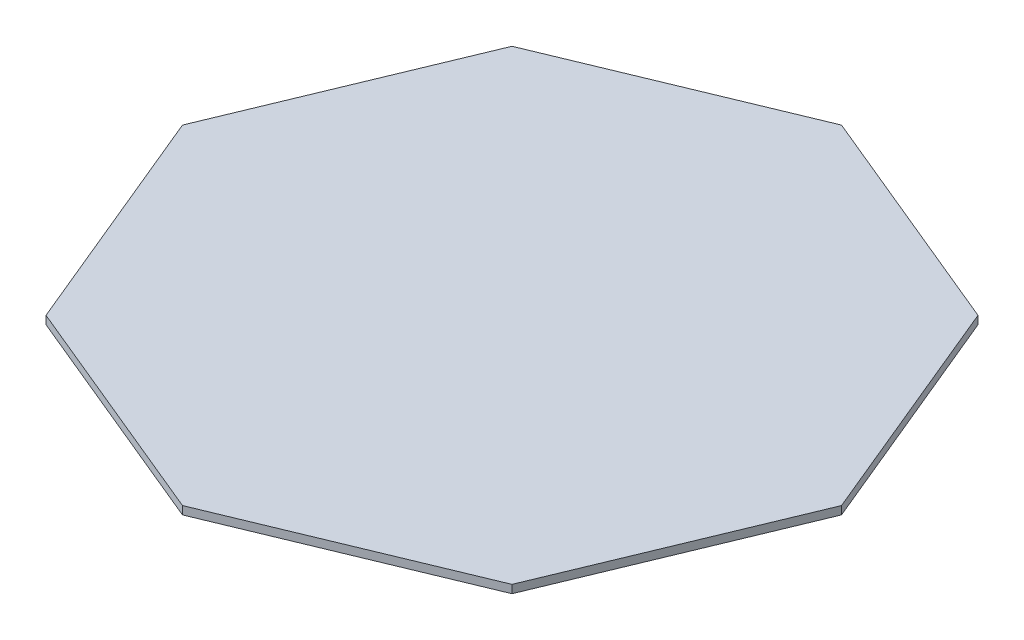
ISO-10303-21;
HEADER;
FILE_DESCRIPTION(('STEP AP214'),'2;1');
FILE_NAME('part.step','',(''),(''),'','','');
FILE_SCHEMA(('AUTOMOTIVE_DESIGN { 1 0 10303 214 1 1 1 1 }'));
ENDSEC;
DATA;
#1=APPLICATION_CONTEXT('core data for automotive mechanical design processes');
#2=APPLICATION_PROTOCOL_DEFINITION('international standard','automotive_design',2000,#1);
#3=PRODUCT_CONTEXT('',#1,'mechanical');
#4=PRODUCT('Part','Part','',(#3));
#5=PRODUCT_RELATED_PRODUCT_CATEGORY('part','',(#4));
#6=PRODUCT_DEFINITION_FORMATION('','',#4);
#7=PRODUCT_DEFINITION_CONTEXT('part definition',#1,'design');
#8=PRODUCT_DEFINITION('design','',#6,#7);
#9=PRODUCT_DEFINITION_SHAPE('','',#8);
#10=(LENGTH_UNIT() NAMED_UNIT(*) SI_UNIT(.MILLI.,.METRE.));
#11=(NAMED_UNIT(*) PLANE_ANGLE_UNIT() SI_UNIT($,.RADIAN.));
#12=(NAMED_UNIT(*) SI_UNIT($,.STERADIAN.) SOLID_ANGLE_UNIT());
#13=UNCERTAINTY_MEASURE_WITH_UNIT(LENGTH_MEASURE(1.E-05),#10,'distance_accuracy_value','');
#14=(GEOMETRIC_REPRESENTATION_CONTEXT(3) GLOBAL_UNCERTAINTY_ASSIGNED_CONTEXT((#13)) GLOBAL_UNIT_ASSIGNED_CONTEXT((#10,
#11,#12)) REPRESENTATION_CONTEXT('',''));
#15=CARTESIAN_POINT('',(0.,0.,0.));
#16=DIRECTION('',(0.,0.,1.));
#17=DIRECTION('',(1.,0.,0.));
#18=AXIS2_PLACEMENT_3D('',#15,#16,#17);
#19=CARTESIAN_POINT('',(57.4025148547629,2.,-57.4025148547641));
#20=DIRECTION('',(-0.382683432365079,0.,0.923879532511291));
#21=DIRECTION('',(0.923879532511291,0.,0.382683432365079));
#22=AXIS2_PLACEMENT_3D('',#19,#20,#21);
#23=PLANE('',#22);
#24=DIRECTION('',(-0.923879532511291,0.,-0.382683432365079));
#25=VECTOR('',#24,1.);
#26=CARTESIAN_POINT('',(57.4025148547629,0.,-57.4025148547641));
#27=LINE('',#26,#25);
#28=CARTESIAN_POINT('',(57.4025148547629,0.,-57.4025148547641));
#29=VERTEX_POINT('',#28);
#30=CARTESIAN_POINT('',(-9.18037341893036E-13,0.,-81.1794150219296));
#31=VERTEX_POINT('',#30);
#32=EDGE_CURVE('E130',#29,#31,#27,.T.);
#33=ORIENTED_EDGE('',*,*,#32,.T.);
#34=DIRECTION('',(0.,-1.,0.));
#35=VECTOR('',#34,1.);
#36=CARTESIAN_POINT('',(-9.18037341893036E-13,2.,-81.1794150219296));
#37=LINE('',#36,#35);
#38=CARTESIAN_POINT('',(-9.18037341893036E-13,2.,-81.1794150219296));
#39=VERTEX_POINT('',#38);
#40=EDGE_CURVE('E11',#39,#31,#37,.T.);
#41=ORIENTED_EDGE('',*,*,#40,.F.);
#42=DIRECTION('',(-0.923879532511291,0.,-0.382683432365079));
#43=VECTOR('',#42,1.);
#44=CARTESIAN_POINT('',(57.4025148547629,2.,-57.4025148547641));
#45=LINE('',#44,#43);
#46=CARTESIAN_POINT('',(57.4025148547629,2.,-57.4025148547641));
#47=VERTEX_POINT('',#46);
#48=EDGE_CURVE('E144',#47,#39,#45,.T.);
#49=ORIENTED_EDGE('',*,*,#48,.F.);
#50=DIRECTION('',(0.,-1.,0.));
#51=VECTOR('',#50,1.);
#52=CARTESIAN_POINT('',(57.4025148547629,2.,-57.4025148547641));
#53=LINE('',#52,#51);
#54=EDGE_CURVE('E126',#47,#29,#53,.T.);
#55=ORIENTED_EDGE('',*,*,#54,.T.);
#56=EDGE_LOOP('',(#33,#41,#49,#55));
#57=FACE_BOUND('',#56,.T.);
#58=ADVANCED_FACE('F34',(#57),#23,.F.);
#59=CARTESIAN_POINT('',(-9.18037341893036E-13,2.,-81.1794150219296));
#60=DIRECTION('',(0.3826834323651,0.,0.923879532511283));
#61=DIRECTION('',(0.923879532511282,0.,-0.3826834323651));
#62=AXIS2_PLACEMENT_3D('',#59,#60,#61);
#63=PLANE('',#62);
#64=DIRECTION('',(-0.923879532511282,0.,0.3826834323651));
#65=VECTOR('',#64,1.);
#66=CARTESIAN_POINT('',(-9.18037341893036E-13,0.,-81.1794150219296));
#67=LINE('',#66,#65);
#68=CARTESIAN_POINT('',(-57.4025148547641,0.,-57.4025148547628));
#69=VERTEX_POINT('',#68);
#70=EDGE_CURVE('E133',#31,#69,#67,.T.);
#71=ORIENTED_EDGE('',*,*,#70,.T.);
#72=DIRECTION('',(0.,-1.,0.));
#73=VECTOR('',#72,1.);
#74=CARTESIAN_POINT('',(-57.4025148547641,2.,-57.4025148547628));
#75=LINE('',#74,#73);
#76=CARTESIAN_POINT('',(-57.4025148547641,2.,-57.4025148547628));
#77=VERTEX_POINT('',#76);
#78=EDGE_CURVE('E42',#77,#69,#75,.T.);
#79=ORIENTED_EDGE('',*,*,#78,.F.);
#80=DIRECTION('',(-0.923879532511282,0.,0.3826834323651));
#81=VECTOR('',#80,1.);
#82=CARTESIAN_POINT('',(-9.18037341893036E-13,2.,-81.1794150219296));
#83=LINE('',#82,#81);
#84=EDGE_CURVE('E93',#39,#77,#83,.T.);
#85=ORIENTED_EDGE('',*,*,#84,.F.);
#86=ORIENTED_EDGE('',*,*,#40,.T.);
#87=EDGE_LOOP('',(#71,#79,#85,#86));
#88=FACE_BOUND('',#87,.T.);
#89=ADVANCED_FACE('F179',(#88),#63,.F.);
#90=CARTESIAN_POINT('',(-57.4025148547641,2.,-57.4025148547628));
#91=DIRECTION('',(0.923879532511291,0.,0.382683432365079));
#92=DIRECTION('',(0.382683432365079,0.,-0.923879532511291));
#93=AXIS2_PLACEMENT_3D('',#90,#91,#92);
#94=PLANE('',#93);
#95=DIRECTION('',(-0.382683432365079,0.,0.923879532511291));
#96=VECTOR('',#95,1.);
#97=CARTESIAN_POINT('',(-57.4025148547641,0.,-57.4025148547628));
#98=LINE('',#97,#96);
#99=CARTESIAN_POINT('',(-81.1794150219295,0.,9.27600230871089E-13));
#100=VERTEX_POINT('',#99);
#101=EDGE_CURVE('E135',#69,#100,#98,.T.);
#102=ORIENTED_EDGE('',*,*,#101,.T.);
#103=DIRECTION('',(0.,-1.,0.));
#104=VECTOR('',#103,1.);
#105=CARTESIAN_POINT('',(-81.1794150219295,2.,9.27600230871089E-13));
#106=LINE('',#105,#104);
#107=CARTESIAN_POINT('',(-81.1794150219295,2.,9.27600230871089E-13));
#108=VERTEX_POINT('',#107);
#109=EDGE_CURVE('E151',#108,#100,#106,.T.);
#110=ORIENTED_EDGE('',*,*,#109,.F.);
#111=DIRECTION('',(-0.382683432365079,0.,0.923879532511291));
#112=VECTOR('',#111,1.);
#113=CARTESIAN_POINT('',(-57.4025148547641,2.,-57.4025148547628));
#114=LINE('',#113,#112);
#115=EDGE_CURVE('E159',#77,#108,#114,.T.);
#116=ORIENTED_EDGE('',*,*,#115,.F.);
#117=ORIENTED_EDGE('',*,*,#78,.T.);
#118=EDGE_LOOP('',(#102,#110,#116,#117));
#119=FACE_BOUND('',#118,.T.);
#120=ADVANCED_FACE('F157',(#119),#94,.F.);
#121=CARTESIAN_POINT('',(-81.1794150219295,2.,9.27600230871089E-13));
#122=DIRECTION('',(0.923879532511283,0.,-0.3826834323651));
#123=DIRECTION('',(-0.3826834323651,0.,-0.923879532511282));
#124=AXIS2_PLACEMENT_3D('',#121,#122,#123);
#125=PLANE('',#124);
#126=DIRECTION('',(0.3826834323651,0.,0.923879532511282));
#127=VECTOR('',#126,1.);
#128=CARTESIAN_POINT('',(-81.1794150219295,0.,9.27600230871089E-13));
#129=LINE('',#128,#127);
#130=CARTESIAN_POINT('',(-57.4025148547628,0.,57.4025148547641));
#131=VERTEX_POINT('',#130);
#132=EDGE_CURVE('E137',#100,#131,#129,.T.);
#133=ORIENTED_EDGE('',*,*,#132,.T.);
#134=DIRECTION('',(0.,-1.,0.));
#135=VECTOR('',#134,1.);
#136=CARTESIAN_POINT('',(-57.4025148547628,2.,57.4025148547641));
#137=LINE('',#136,#135);
#138=CARTESIAN_POINT('',(-57.4025148547628,2.,57.4025148547641));
#139=VERTEX_POINT('',#138);
#140=EDGE_CURVE('E148',#139,#131,#137,.T.);
#141=ORIENTED_EDGE('',*,*,#140,.F.);
#142=DIRECTION('',(0.3826834323651,0.,0.923879532511282));
#143=VECTOR('',#142,1.);
#144=CARTESIAN_POINT('',(-81.1794150219295,2.,9.27600230871089E-13));
#145=LINE('',#144,#143);
#146=EDGE_CURVE('E171',#108,#139,#145,.T.);
#147=ORIENTED_EDGE('',*,*,#146,.F.);
#148=ORIENTED_EDGE('',*,*,#109,.T.);
#149=EDGE_LOOP('',(#133,#141,#147,#148));
#150=FACE_BOUND('',#149,.T.);
#151=ADVANCED_FACE('F167',(#150),#125,.F.);
#152=CARTESIAN_POINT('',(-57.4025148547628,2.,57.4025148547641));
#153=DIRECTION('',(0.382683432365079,0.,-0.923879532511291));
#154=DIRECTION('',(-0.923879532511291,0.,-0.382683432365079));
#155=AXIS2_PLACEMENT_3D('',#152,#153,#154);
#156=PLANE('',#155);
#157=DIRECTION('',(0.923879532511291,0.,0.382683432365079));
#158=VECTOR('',#157,1.);
#159=CARTESIAN_POINT('',(-57.4025148547628,0.,57.4025148547641));
#160=LINE('',#159,#158);
#161=CARTESIAN_POINT('',(9.74822958239818E-13,0.,81.1794150219296));
#162=VERTEX_POINT('',#161);
#163=EDGE_CURVE('E139',#131,#162,#160,.T.);
#164=ORIENTED_EDGE('',*,*,#163,.T.);
#165=DIRECTION('',(0.,-1.,0.));
#166=VECTOR('',#165,1.);
#167=CARTESIAN_POINT('',(9.74822958239818E-13,2.,81.1794150219296));
#168=LINE('',#167,#166);
#169=CARTESIAN_POINT('',(9.74822958239818E-13,2.,81.1794150219296));
#170=VERTEX_POINT('',#169);
#171=EDGE_CURVE('E121',#170,#162,#168,.T.);
#172=ORIENTED_EDGE('',*,*,#171,.F.);
#173=DIRECTION('',(0.923879532511291,0.,0.382683432365079));
#174=VECTOR('',#173,1.);
#175=CARTESIAN_POINT('',(-57.4025148547628,2.,57.4025148547641));
#176=LINE('',#175,#174);
#177=EDGE_CURVE('E112',#139,#170,#176,.T.);
#178=ORIENTED_EDGE('',*,*,#177,.F.);
#179=ORIENTED_EDGE('',*,*,#140,.T.);
#180=EDGE_LOOP('',(#164,#172,#178,#179));
#181=FACE_BOUND('',#180,.T.);
#182=ADVANCED_FACE('F170',(#181),#156,.F.);
#183=CARTESIAN_POINT('',(9.74822958239818E-13,2.,81.1794150219296));
#184=DIRECTION('',(-0.3826834323651,0.,-0.923879532511283));
#185=DIRECTION('',(-0.923879532511283,0.,0.3826834323651));
#186=AXIS2_PLACEMENT_3D('',#183,#184,#185);
#187=PLANE('',#186);
#188=DIRECTION('',(0.923879532511282,0.,-0.3826834323651));
#189=VECTOR('',#188,1.);
#190=CARTESIAN_POINT('',(9.74822958239818E-13,0.,81.1794150219296));
#191=LINE('',#190,#189);
#192=CARTESIAN_POINT('',(57.4025148547641,0.,57.4025148547629));
#193=VERTEX_POINT('',#192);
#194=EDGE_CURVE('E120',#162,#193,#191,.T.);
#195=ORIENTED_EDGE('',*,*,#194,.T.);
#196=DIRECTION('',(0.,-1.,0.));
#197=VECTOR('',#196,1.);
#198=CARTESIAN_POINT('',(57.4025148547641,2.,57.4025148547629));
#199=LINE('',#198,#197);
#200=CARTESIAN_POINT('',(57.4025148547641,2.,57.4025148547629));
#201=VERTEX_POINT('',#200);
#202=EDGE_CURVE('E117',#201,#193,#199,.T.);
#203=ORIENTED_EDGE('',*,*,#202,.F.);
#204=DIRECTION('',(0.923879532511282,0.,-0.3826834323651));
#205=VECTOR('',#204,1.);
#206=CARTESIAN_POINT('',(9.74822958239818E-13,2.,81.1794150219296));
#207=LINE('',#206,#205);
#208=EDGE_CURVE('E106',#170,#201,#207,.T.);
#209=ORIENTED_EDGE('',*,*,#208,.F.);
#210=ORIENTED_EDGE('',*,*,#171,.T.);
#211=EDGE_LOOP('',(#195,#203,#209,#210));
#212=FACE_BOUND('',#211,.T.);
#213=ADVANCED_FACE('F118',(#212),#187,.F.);
#214=CARTESIAN_POINT('',(57.4025148547641,2.,57.4025148547629));
#215=DIRECTION('',(-0.923879532511291,0.,-0.38268343236508));
#216=DIRECTION('',(-0.38268343236508,0.,0.923879532511291));
#217=AXIS2_PLACEMENT_3D('',#214,#215,#216);
#218=PLANE('',#217);
#219=DIRECTION('',(0.38268343236508,0.,-0.923879532511291));
#220=VECTOR('',#219,1.);
#221=CARTESIAN_POINT('',(57.4025148547641,0.,57.4025148547629));
#222=LINE('',#221,#220);
#223=CARTESIAN_POINT('',(81.1794150219296,0.,-8.50309237941807E-13));
#224=VERTEX_POINT('',#223);
#225=EDGE_CURVE('E79',#193,#224,#222,.T.);
#226=ORIENTED_EDGE('',*,*,#225,.T.);
#227=DIRECTION('',(0.,-1.,0.));
#228=VECTOR('',#227,1.);
#229=CARTESIAN_POINT('',(81.1794150219296,2.,-8.50309237941807E-13));
#230=LINE('',#229,#228);
#231=CARTESIAN_POINT('',(81.1794150219296,2.,-8.50309237941807E-13));
#232=VERTEX_POINT('',#231);
#233=EDGE_CURVE('E122',#232,#224,#230,.T.);
#234=ORIENTED_EDGE('',*,*,#233,.F.);
#235=DIRECTION('',(0.38268343236508,0.,-0.923879532511291));
#236=VECTOR('',#235,1.);
#237=CARTESIAN_POINT('',(57.4025148547641,2.,57.4025148547629));
#238=LINE('',#237,#236);
#239=EDGE_CURVE('E110',#201,#232,#238,.T.);
#240=ORIENTED_EDGE('',*,*,#239,.F.);
#241=ORIENTED_EDGE('',*,*,#202,.T.);
#242=EDGE_LOOP('',(#226,#234,#240,#241));
#243=FACE_BOUND('',#242,.T.);
#244=ADVANCED_FACE('F124',(#243),#218,.F.);
#245=CARTESIAN_POINT('',(81.1794150219296,2.,-8.50309237941807E-13));
#246=DIRECTION('',(-0.923879532511283,0.,0.382683432365099));
#247=DIRECTION('',(0.3826834323651,0.,0.923879532511283));
#248=AXIS2_PLACEMENT_3D('',#245,#246,#247);
#249=PLANE('',#248);
#250=DIRECTION('',(-0.382683432365099,0.,-0.923879532511283));
#251=VECTOR('',#250,1.);
#252=CARTESIAN_POINT('',(81.1794150219296,0.,-8.50309237941807E-13));
#253=LINE('',#252,#251);
#254=EDGE_CURVE('E85',#224,#29,#253,.T.);
#255=ORIENTED_EDGE('',*,*,#254,.T.);
#256=ORIENTED_EDGE('',*,*,#54,.F.);
#257=DIRECTION('',(-0.382683432365099,0.,-0.923879532511283));
#258=VECTOR('',#257,1.);
#259=CARTESIAN_POINT('',(81.1794150219296,2.,-8.50309237941807E-13));
#260=LINE('',#259,#258);
#261=EDGE_CURVE('E50',#232,#47,#260,.T.);
#262=ORIENTED_EDGE('',*,*,#261,.F.);
#263=ORIENTED_EDGE('',*,*,#233,.T.);
#264=EDGE_LOOP('',(#255,#256,#262,#263));
#265=FACE_BOUND('',#264,.T.);
#266=ADVANCED_FACE('F195',(#265),#249,.F.);
#267=CARTESIAN_POINT('',(0.,2.,0.));
#268=DIRECTION('',(0.,1.,0.));
#269=DIRECTION('',(0.,0.,1.));
#270=AXIS2_PLACEMENT_3D('',#267,#268,#269);
#271=PLANE('',#270);
#272=ORIENTED_EDGE('',*,*,#48,.T.);
#273=ORIENTED_EDGE('',*,*,#84,.T.);
#274=ORIENTED_EDGE('',*,*,#115,.T.);
#275=ORIENTED_EDGE('',*,*,#146,.T.);
#276=ORIENTED_EDGE('',*,*,#177,.T.);
#277=ORIENTED_EDGE('',*,*,#208,.T.);
#278=ORIENTED_EDGE('',*,*,#239,.T.);
#279=ORIENTED_EDGE('',*,*,#261,.T.);
#280=EDGE_LOOP('',(#272,#273,#274,#275,#276,#277,#278,#279));
#281=FACE_BOUND('',#280,.T.);
#282=ADVANCED_FACE('F108',(#281),#271,.T.);
#283=CARTESIAN_POINT('',(0.,0.,0.));
#284=DIRECTION('',(0.,1.,0.));
#285=DIRECTION('',(0.,0.,1.));
#286=AXIS2_PLACEMENT_3D('',#283,#284,#285);
#287=PLANE('',#286);
#288=ORIENTED_EDGE('',*,*,#32,.F.);
#289=ORIENTED_EDGE('',*,*,#254,.F.);
#290=ORIENTED_EDGE('',*,*,#225,.F.);
#291=ORIENTED_EDGE('',*,*,#194,.F.);
#292=ORIENTED_EDGE('',*,*,#163,.F.);
#293=ORIENTED_EDGE('',*,*,#132,.F.);
#294=ORIENTED_EDGE('',*,*,#101,.F.);
#295=ORIENTED_EDGE('',*,*,#70,.F.);
#296=EDGE_LOOP('',(#288,#289,#290,#291,#292,#293,#294,#295));
#297=FACE_BOUND('',#296,.T.);
#298=ADVANCED_FACE('F163',(#297),#287,.F.);
#299=CLOSED_SHELL('',(#58,#89,#120,#151,#182,#213,#244,#266,#282,#298));
#300=MANIFOLD_SOLID_BREP('B2',#299);
#301=ADVANCED_BREP_SHAPE_REPRESENTATION('',(#18,#300),#14);
#302=SHAPE_DEFINITION_REPRESENTATION(#9,#301);
ENDSEC;
END-ISO-10303-21;
